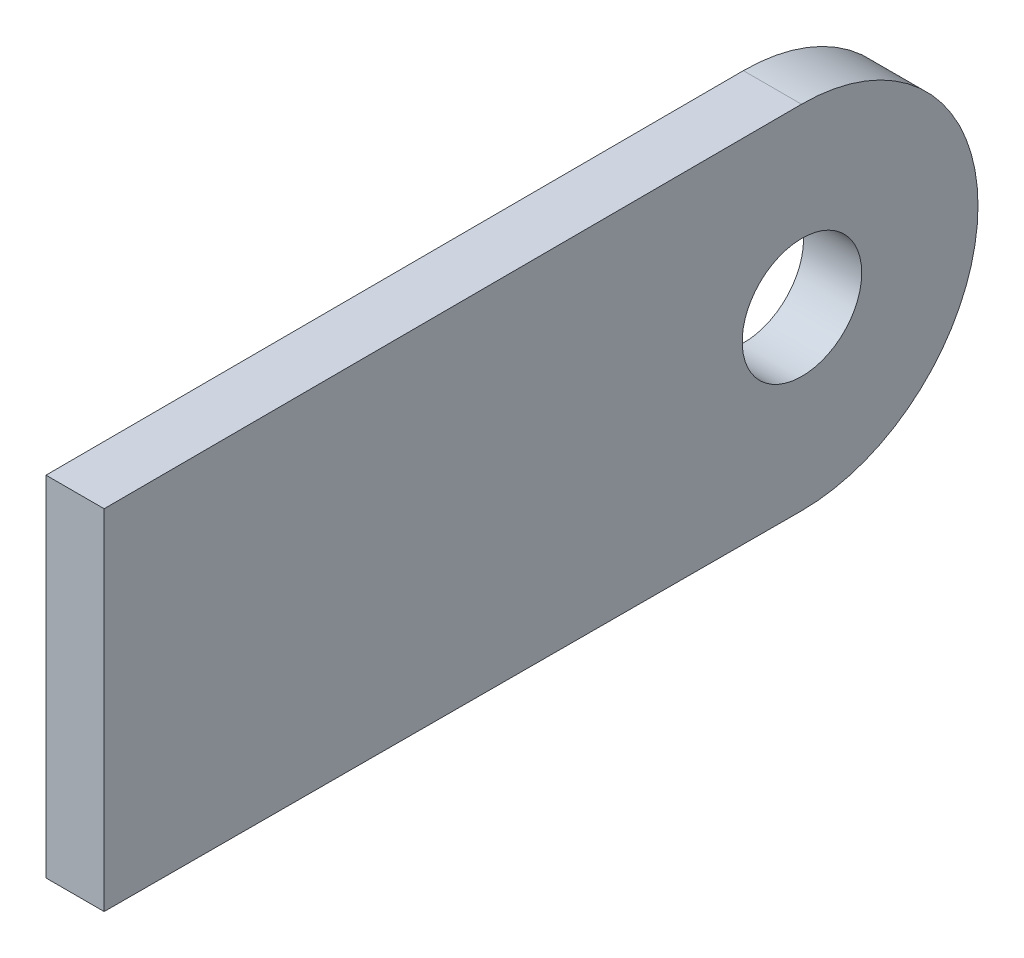
ISO-10303-21;
HEADER;
FILE_DESCRIPTION(('STEP AP214'),'2;1');
FILE_NAME('part.step','',(''),(''),'','','');
FILE_SCHEMA(('AUTOMOTIVE_DESIGN { 1 0 10303 214 1 1 1 1 }'));
ENDSEC;
DATA;
#1=APPLICATION_CONTEXT('core data for automotive mechanical design processes');
#2=APPLICATION_PROTOCOL_DEFINITION('international standard','automotive_design',2000,#1);
#3=PRODUCT_CONTEXT('',#1,'mechanical');
#4=PRODUCT('Part','Part','',(#3));
#5=PRODUCT_RELATED_PRODUCT_CATEGORY('part','',(#4));
#6=PRODUCT_DEFINITION_FORMATION('','',#4);
#7=PRODUCT_DEFINITION_CONTEXT('part definition',#1,'design');
#8=PRODUCT_DEFINITION('design','',#6,#7);
#9=PRODUCT_DEFINITION_SHAPE('','',#8);
#10=(LENGTH_UNIT() NAMED_UNIT(*) SI_UNIT(.MILLI.,.METRE.));
#11=(NAMED_UNIT(*) PLANE_ANGLE_UNIT() SI_UNIT($,.RADIAN.));
#12=(NAMED_UNIT(*) SI_UNIT($,.STERADIAN.) SOLID_ANGLE_UNIT());
#13=UNCERTAINTY_MEASURE_WITH_UNIT(LENGTH_MEASURE(1.E-05),#10,'distance_accuracy_value','');
#14=(GEOMETRIC_REPRESENTATION_CONTEXT(3) GLOBAL_UNCERTAINTY_ASSIGNED_CONTEXT((#13)) GLOBAL_UNIT_ASSIGNED_CONTEXT((#10,
#11,#12)) REPRESENTATION_CONTEXT('',''));
#15=CARTESIAN_POINT('',(0.,0.,0.));
#16=DIRECTION('',(0.,0.,1.));
#17=DIRECTION('',(1.,0.,0.));
#18=AXIS2_PLACEMENT_3D('',#15,#16,#17);
#19=CARTESIAN_POINT('',(1.58749999999999,0.,2.22044604925031E-13));
#20=DIRECTION('',(1.,0.,0.));
#21=DIRECTION('',(0.,0.,-1.));
#22=AXIS2_PLACEMENT_3D('',#19,#20,#21);
#23=PLANE('',#22);
#24=DIRECTION('',(0.,-0.00233401428709717,0.999997276184945));
#25=VECTOR('',#24,1.);
#26=CARTESIAN_POINT('',(1.58750000000002,9.61387381351447,0.022438979954742));
#27=LINE('',#26,#25);
#28=CARTESIAN_POINT('',(1.58750000000002,9.61387381351447,0.022438979954742));
#29=VERTEX_POINT('',#28);
#30=CARTESIAN_POINT('',(1.58750000000002,9.52500000000012,38.1000000000004));
#31=VERTEX_POINT('',#30);
#32=EDGE_CURVE('E87',#29,#31,#27,.T.);
#33=ORIENTED_EDGE('',*,*,#32,.T.);
#34=DIRECTION('',(0.,-1.,0.));
#35=VECTOR('',#34,1.);
#36=CARTESIAN_POINT('',(1.58750000000002,9.52500000000012,38.1000000000004));
#37=LINE('',#36,#35);
#38=CARTESIAN_POINT('',(1.58749999999996,-9.52500000000009,38.1000000000001));
#39=VERTEX_POINT('',#38);
#40=EDGE_CURVE('E82',#31,#39,#37,.T.);
#41=ORIENTED_EDGE('',*,*,#40,.T.);
#42=DIRECTION('',(0.,-0.00233401428709756,-0.999997276184945));
#43=VECTOR('',#42,1.);
#44=CARTESIAN_POINT('',(1.58749999999985,-9.6138738135145,0.0224389799546865));
#45=LINE('',#44,#43);
#46=CARTESIAN_POINT('',(1.58749999999985,-9.6138738135145,0.0224389799546865));
#47=VERTEX_POINT('',#46);
#48=EDGE_CURVE('E85',#39,#47,#45,.T.);
#49=ORIENTED_EDGE('',*,*,#48,.T.);
#50=CARTESIAN_POINT('',(1.58749999999999,0.,2.22044604925031E-13));
#51=DIRECTION('',(1.,0.,0.));
#52=DIRECTION('',(0.,0.,-1.));
#53=AXIS2_PLACEMENT_3D('',#50,#51,#52);
#54=CIRCLE('',#53,9.61390000000001);
#55=EDGE_CURVE('E52',#47,#29,#54,.T.);
#56=ORIENTED_EDGE('',*,*,#55,.T.);
#57=EDGE_LOOP('',(#33,#41,#49,#56));
#58=FACE_BOUND('',#57,.T.);
#59=CARTESIAN_POINT('',(1.58749999999999,0.,2.22044604925031E-13));
#60=DIRECTION('',(1.,0.,0.));
#61=DIRECTION('',(0.,0.,-1.));
#62=AXIS2_PLACEMENT_3D('',#59,#60,#61);
#63=CIRCLE('',#62,3.2639);
#64=CARTESIAN_POINT('',(1.58749999999999,0.,-3.26389999999978));
#65=VERTEX_POINT('',#64);
#66=EDGE_CURVE('E108',#65,#65,#63,.T.);
#67=ORIENTED_EDGE('',*,*,#66,.F.);
#68=EDGE_LOOP('',(#67));
#69=FACE_BOUND('',#68,.T.);
#70=ADVANCED_FACE('F34',(#58,#69),#23,.T.);
#71=CARTESIAN_POINT('',(-1.58750000000013,1.66533453693773E-13,1.66533453693773E-13));
#72=DIRECTION('',(1.,0.,0.));
#73=DIRECTION('',(0.,0.,-1.));
#74=AXIS2_PLACEMENT_3D('',#71,#72,#73);
#75=PLANE('',#74);
#76=DIRECTION('',(0.,-0.00233401428709717,0.999997276184945));
#77=VECTOR('',#76,1.);
#78=CARTESIAN_POINT('',(-1.58750000000007,9.6138738135147,0.0224389799547975));
#79=LINE('',#78,#77);
#80=CARTESIAN_POINT('',(-1.58750000000007,9.6138738135147,0.0224389799547975));
#81=VERTEX_POINT('',#80);
#82=CARTESIAN_POINT('',(-1.58750000000002,9.52500000000001,38.1000000000001));
#83=VERTEX_POINT('',#82);
#84=EDGE_CURVE('E104',#81,#83,#79,.T.);
#85=ORIENTED_EDGE('',*,*,#84,.F.);
#86=CARTESIAN_POINT('',(-1.58750000000013,1.66533453693773E-13,1.66533453693773E-13));
#87=DIRECTION('',(1.,0.,0.));
#88=DIRECTION('',(0.,0.,-1.));
#89=AXIS2_PLACEMENT_3D('',#86,#87,#88);
#90=CIRCLE('',#89,9.61390000000001);
#91=CARTESIAN_POINT('',(-1.58750000000005,-9.61387381351431,0.0224389799549085));
#92=VERTEX_POINT('',#91);
#93=EDGE_CURVE('E75',#92,#81,#90,.T.);
#94=ORIENTED_EDGE('',*,*,#93,.F.);
#95=DIRECTION('',(0.,-0.00233401428709756,-0.999997276184945));
#96=VECTOR('',#95,1.);
#97=CARTESIAN_POINT('',(-1.58750000000005,-9.61387381351431,0.0224389799549085));
#98=LINE('',#97,#96);
#99=CARTESIAN_POINT('',(-1.58749999999999,-9.52500000000001,38.1000000000001));
#100=VERTEX_POINT('',#99);
#101=EDGE_CURVE('E69',#100,#92,#98,.T.);
#102=ORIENTED_EDGE('',*,*,#101,.F.);
#103=DIRECTION('',(0.,-1.,0.));
#104=VECTOR('',#103,1.);
#105=CARTESIAN_POINT('',(-1.58750000000002,9.52500000000001,38.1000000000001));
#106=LINE('',#105,#104);
#107=EDGE_CURVE('E92',#83,#100,#106,.T.);
#108=ORIENTED_EDGE('',*,*,#107,.F.);
#109=EDGE_LOOP('',(#85,#94,#102,#108));
#110=FACE_BOUND('',#109,.T.);
#111=CARTESIAN_POINT('',(-1.58750000000013,1.66533453693773E-13,1.66533453693773E-13));
#112=DIRECTION('',(1.,0.,0.));
#113=DIRECTION('',(0.,0.,-1.));
#114=AXIS2_PLACEMENT_3D('',#111,#112,#113);
#115=CIRCLE('',#114,3.2639);
#116=CARTESIAN_POINT('',(-1.58750000000014,1.67439367926292E-13,-3.26389999999983));
#117=VERTEX_POINT('',#116);
#118=EDGE_CURVE('E128',#117,#117,#115,.T.);
#119=ORIENTED_EDGE('',*,*,#118,.T.);
#120=EDGE_LOOP('',(#119));
#121=FACE_BOUND('',#120,.T.);
#122=ADVANCED_FACE('F122',(#110,#121),#75,.F.);
#123=CARTESIAN_POINT('',(1.58750000000002,9.61387381351447,0.022438979954742));
#124=DIRECTION('',(0.,-0.999997276184949,-0.00233401428709612));
#125=DIRECTION('',(0.,0.00233401428709773,-0.999997276184945));
#126=AXIS2_PLACEMENT_3D('',#123,#124,#125);
#127=PLANE('',#126);
#128=ORIENTED_EDGE('',*,*,#84,.T.);
#129=DIRECTION('',(-1.,0.,0.));
#130=VECTOR('',#129,1.);
#131=CARTESIAN_POINT('',(1.58750000000002,9.52500000000012,38.1000000000004));
#132=LINE('',#131,#130);
#133=EDGE_CURVE('E11',#31,#83,#132,.T.);
#134=ORIENTED_EDGE('',*,*,#133,.F.);
#135=ORIENTED_EDGE('',*,*,#32,.F.);
#136=DIRECTION('',(-1.,0.,0.));
#137=VECTOR('',#136,1.);
#138=CARTESIAN_POINT('',(1.58750000000002,9.61387381351447,0.022438979954742));
#139=LINE('',#138,#137);
#140=EDGE_CURVE('E100',#29,#81,#139,.T.);
#141=ORIENTED_EDGE('',*,*,#140,.T.);
#142=EDGE_LOOP('',(#128,#134,#135,#141));
#143=FACE_BOUND('',#142,.T.);
#144=ADVANCED_FACE('F36',(#143),#127,.F.);
#145=CARTESIAN_POINT('',(1.58750000000002,9.52500000000012,38.1000000000004));
#146=DIRECTION('',(0.,0.,-1.));
#147=DIRECTION('',(0.,1.,0.));
#148=AXIS2_PLACEMENT_3D('',#145,#146,#147);
#149=PLANE('',#148);
#150=ORIENTED_EDGE('',*,*,#107,.T.);
#151=DIRECTION('',(-1.,0.,0.));
#152=VECTOR('',#151,1.);
#153=CARTESIAN_POINT('',(1.58749999999996,-9.52500000000009,38.1000000000001));
#154=LINE('',#153,#152);
#155=EDGE_CURVE('E44',#39,#100,#154,.T.);
#156=ORIENTED_EDGE('',*,*,#155,.F.);
#157=ORIENTED_EDGE('',*,*,#40,.F.);
#158=ORIENTED_EDGE('',*,*,#133,.T.);
#159=EDGE_LOOP('',(#150,#156,#157,#158));
#160=FACE_BOUND('',#159,.T.);
#161=ADVANCED_FACE('F91',(#160),#149,.F.);
#162=CARTESIAN_POINT('',(1.58749999999985,-9.6138738135145,0.0224389799546865));
#163=DIRECTION('',(0.,0.999997276184948,-0.0023340142870989));
#164=DIRECTION('',(0.,0.00233401428709701,0.999997276184945));
#165=AXIS2_PLACEMENT_3D('',#162,#163,#164);
#166=PLANE('',#165);
#167=ORIENTED_EDGE('',*,*,#101,.T.);
#168=DIRECTION('',(-1.,0.,0.));
#169=VECTOR('',#168,1.);
#170=CARTESIAN_POINT('',(1.58749999999985,-9.6138738135145,0.0224389799546865));
#171=LINE('',#170,#169);
#172=EDGE_CURVE('E94',#47,#92,#171,.T.);
#173=ORIENTED_EDGE('',*,*,#172,.F.);
#174=ORIENTED_EDGE('',*,*,#48,.F.);
#175=ORIENTED_EDGE('',*,*,#155,.T.);
#176=EDGE_LOOP('',(#167,#173,#174,#175));
#177=FACE_BOUND('',#176,.T.);
#178=ADVANCED_FACE('F95',(#177),#166,.F.);
#179=CARTESIAN_POINT('',(1.58749999999999,0.,2.22044604925031E-13));
#180=DIRECTION('',(-1.,0.,0.));
#181=DIRECTION('',(0.,0.,1.));
#182=AXIS2_PLACEMENT_3D('',#179,#180,#181);
#183=CYLINDRICAL_SURFACE('',#182,9.61390000000001);
#184=ORIENTED_EDGE('',*,*,#93,.T.);
#185=ORIENTED_EDGE('',*,*,#140,.F.);
#186=ORIENTED_EDGE('',*,*,#55,.F.);
#187=ORIENTED_EDGE('',*,*,#172,.T.);
#188=EDGE_LOOP('',(#184,#185,#186,#187));
#189=FACE_BOUND('',#188,.T.);
#190=ADVANCED_FACE('F119',(#189),#183,.T.);
#191=CARTESIAN_POINT('',(1.58749999999999,0.,2.22044604925031E-13));
#192=DIRECTION('',(-1.,0.,0.));
#193=DIRECTION('',(0.,0.,1.));
#194=AXIS2_PLACEMENT_3D('',#191,#192,#193);
#195=CYLINDRICAL_SURFACE('',#194,3.2639);
#196=ORIENTED_EDGE('',*,*,#66,.T.);
#197=EDGE_LOOP('',(#196));
#198=FACE_BOUND('',#197,.T.);
#199=ORIENTED_EDGE('',*,*,#118,.F.);
#200=EDGE_LOOP('',(#199));
#201=FACE_BOUND('',#200,.T.);
#202=ADVANCED_FACE('F137',(#198,#201),#195,.F.);
#203=CLOSED_SHELL('',(#70,#122,#144,#161,#178,#190,#202));
#204=MANIFOLD_SOLID_BREP('B2',#203);
#205=ADVANCED_BREP_SHAPE_REPRESENTATION('',(#18,#204),#14);
#206=SHAPE_DEFINITION_REPRESENTATION(#9,#205);
ENDSEC;
END-ISO-10303-21;
